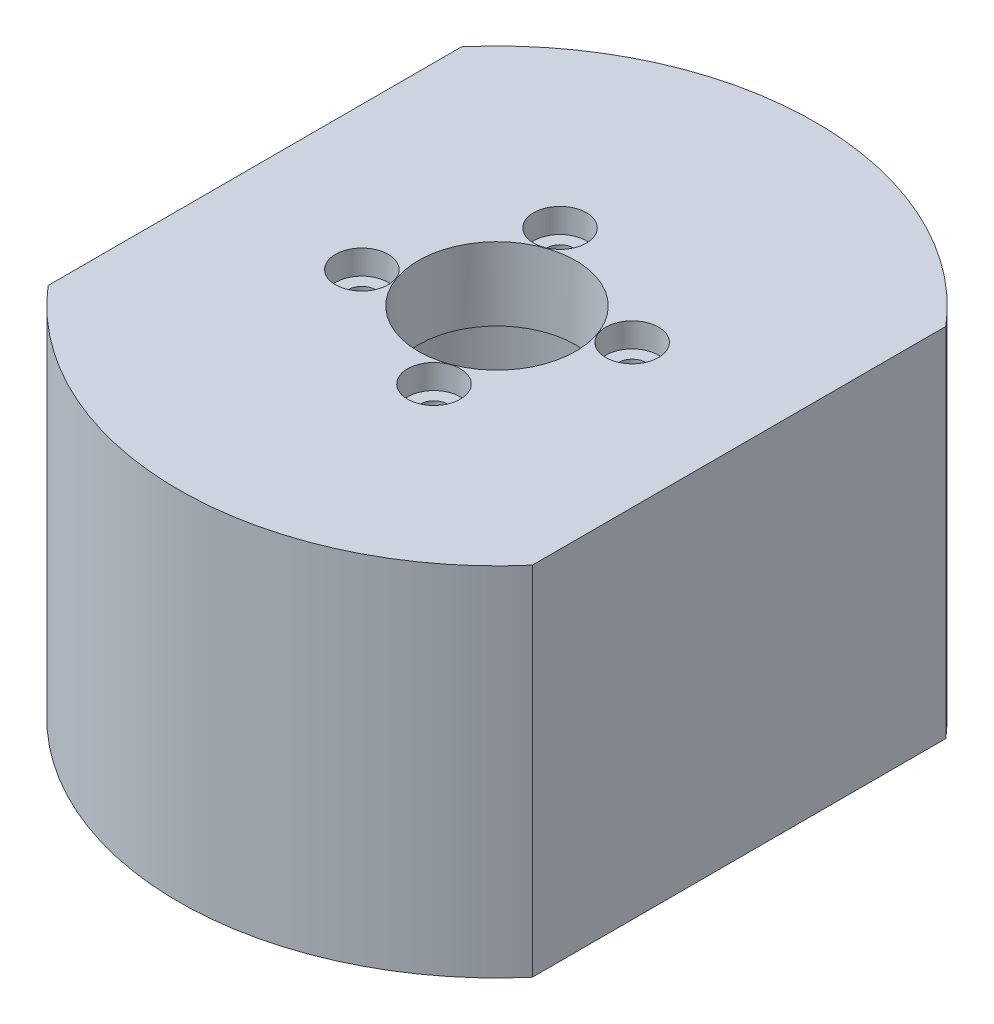
ISO-10303-21;
HEADER;
FILE_DESCRIPTION(('STEP AP214'),'2;1');
FILE_NAME('part.step','',(''),(''),'','','');
FILE_SCHEMA(('AUTOMOTIVE_DESIGN { 1 0 10303 214 1 1 1 1 }'));
ENDSEC;
DATA;
#1=APPLICATION_CONTEXT('core data for automotive mechanical design processes');
#2=APPLICATION_PROTOCOL_DEFINITION('international standard','automotive_design',2000,#1);
#3=PRODUCT_CONTEXT('',#1,'mechanical');
#4=PRODUCT('Part','Part','',(#3));
#5=PRODUCT_RELATED_PRODUCT_CATEGORY('part','',(#4));
#6=PRODUCT_DEFINITION_FORMATION('','',#4);
#7=PRODUCT_DEFINITION_CONTEXT('part definition',#1,'design');
#8=PRODUCT_DEFINITION('design','',#6,#7);
#9=PRODUCT_DEFINITION_SHAPE('','',#8);
#10=(LENGTH_UNIT() NAMED_UNIT(*) SI_UNIT(.MILLI.,.METRE.));
#11=(NAMED_UNIT(*) PLANE_ANGLE_UNIT() SI_UNIT($,.RADIAN.));
#12=(NAMED_UNIT(*) SI_UNIT($,.STERADIAN.) SOLID_ANGLE_UNIT());
#13=UNCERTAINTY_MEASURE_WITH_UNIT(LENGTH_MEASURE(1.E-05),#10,'distance_accuracy_value','');
#14=(GEOMETRIC_REPRESENTATION_CONTEXT(3) GLOBAL_UNCERTAINTY_ASSIGNED_CONTEXT((#13)) GLOBAL_UNIT_ASSIGNED_CONTEXT((#10,
#11,#12)) REPRESENTATION_CONTEXT('',''));
#15=CARTESIAN_POINT('',(0.,0.,0.));
#16=DIRECTION('',(0.,0.,1.));
#17=DIRECTION('',(1.,0.,0.));
#18=AXIS2_PLACEMENT_3D('',#15,#16,#17);
#19=CARTESIAN_POINT('',(-4.4462618632337,44.,-12.2160040702168));
#20=DIRECTION('',(0.,1.,0.));
#21=DIRECTION('',(0.,0.,1.));
#22=AXIS2_PLACEMENT_3D('',#19,#20,#21);
#23=CYLINDRICAL_SURFACE('',#22,1.69999999999999);
#24=CARTESIAN_POINT('',(-4.4462618632337,41.,-12.2160040702168));
#25=DIRECTION('',(0.,1.,0.));
#26=DIRECTION('',(0.,0.,1.));
#27=AXIS2_PLACEMENT_3D('',#24,#25,#26);
#28=CIRCLE('',#27,1.7);
#29=CARTESIAN_POINT('',(-4.4462618632337,41.,-10.5160040702168));
#30=VERTEX_POINT('',#29);
#31=EDGE_CURVE('E87',#30,#30,#28,.T.);
#32=ORIENTED_EDGE('',*,*,#31,.T.);
#33=EDGE_LOOP('',(#32));
#34=FACE_BOUND('',#33,.T.);
#35=CARTESIAN_POINT('',(-4.4462618632337,35.,-12.2160040702168));
#36=DIRECTION('',(0.,-1.,0.));
#37=DIRECTION('',(0.,0.,-1.));
#38=AXIS2_PLACEMENT_3D('',#35,#36,#37);
#39=CIRCLE('',#38,1.69999999999999);
#40=CARTESIAN_POINT('',(-4.4462618632337,35.,-13.9160040702168));
#41=VERTEX_POINT('',#40);
#42=EDGE_CURVE('E122',#41,#41,#39,.F.);
#43=ORIENTED_EDGE('',*,*,#42,.F.);
#44=EDGE_LOOP('',(#43));
#45=FACE_BOUND('',#44,.T.);
#46=ADVANCED_FACE('F39',(#34,#45),#23,.F.);
#47=CARTESIAN_POINT('',(12.2160040702168,44.,-4.44626186323366));
#48=DIRECTION('',(0.,1.,0.));
#49=DIRECTION('',(0.,0.,1.));
#50=AXIS2_PLACEMENT_3D('',#47,#48,#49);
#51=CYLINDRICAL_SURFACE('',#50,1.69999999999999);
#52=CARTESIAN_POINT('',(12.2160040702168,41.,-4.44626186323366));
#53=DIRECTION('',(0.,1.,0.));
#54=DIRECTION('',(0.,0.,1.));
#55=AXIS2_PLACEMENT_3D('',#52,#53,#54);
#56=CIRCLE('',#55,1.7);
#57=CARTESIAN_POINT('',(12.2160040702168,41.,-2.74626186323366));
#58=VERTEX_POINT('',#57);
#59=EDGE_CURVE('E149',#58,#58,#56,.T.);
#60=ORIENTED_EDGE('',*,*,#59,.T.);
#61=EDGE_LOOP('',(#60));
#62=FACE_BOUND('',#61,.T.);
#63=CARTESIAN_POINT('',(12.2160040702168,35.,-4.44626186323366));
#64=DIRECTION('',(0.,-1.,0.));
#65=DIRECTION('',(0.,0.,-1.));
#66=AXIS2_PLACEMENT_3D('',#63,#64,#65);
#67=CIRCLE('',#66,1.69999999999999);
#68=CARTESIAN_POINT('',(12.2160040702168,35.,-6.14626186323365));
#69=VERTEX_POINT('',#68);
#70=EDGE_CURVE('E119',#69,#69,#67,.F.);
#71=ORIENTED_EDGE('',*,*,#70,.F.);
#72=EDGE_LOOP('',(#71));
#73=FACE_BOUND('',#72,.T.);
#74=ADVANCED_FACE('F178',(#62,#73),#51,.F.);
#75=CARTESIAN_POINT('',(4.4462618632337,44.,12.2160040702168));
#76=DIRECTION('',(0.,1.,0.));
#77=DIRECTION('',(0.,0.,1.));
#78=AXIS2_PLACEMENT_3D('',#75,#76,#77);
#79=CYLINDRICAL_SURFACE('',#78,1.69999999999999);
#80=CARTESIAN_POINT('',(4.4462618632337,41.,12.2160040702168));
#81=DIRECTION('',(0.,1.,0.));
#82=DIRECTION('',(0.,0.,1.));
#83=AXIS2_PLACEMENT_3D('',#80,#81,#82);
#84=CIRCLE('',#83,1.7);
#85=CARTESIAN_POINT('',(4.4462618632337,41.,13.9160040702168));
#86=VERTEX_POINT('',#85);
#87=EDGE_CURVE('E140',#86,#86,#84,.T.);
#88=ORIENTED_EDGE('',*,*,#87,.T.);
#89=EDGE_LOOP('',(#88));
#90=FACE_BOUND('',#89,.T.);
#91=CARTESIAN_POINT('',(4.4462618632337,35.,12.2160040702168));
#92=DIRECTION('',(0.,-1.,0.));
#93=DIRECTION('',(0.,0.,-1.));
#94=AXIS2_PLACEMENT_3D('',#91,#92,#93);
#95=CIRCLE('',#94,1.69999999999999);
#96=CARTESIAN_POINT('',(4.4462618632337,35.,10.5160040702168));
#97=VERTEX_POINT('',#96);
#98=EDGE_CURVE('E116',#97,#97,#95,.F.);
#99=ORIENTED_EDGE('',*,*,#98,.F.);
#100=EDGE_LOOP('',(#99));
#101=FACE_BOUND('',#100,.T.);
#102=ADVANCED_FACE('F169',(#90,#101),#79,.F.);
#103=CARTESIAN_POINT('',(-12.2160040702169,44.,4.44626186323358));
#104=DIRECTION('',(0.,1.,0.));
#105=DIRECTION('',(0.,0.,1.));
#106=AXIS2_PLACEMENT_3D('',#103,#104,#105);
#107=CYLINDRICAL_SURFACE('',#106,1.69999999999999);
#108=CARTESIAN_POINT('',(-12.2160040702169,41.,4.44626186323358));
#109=DIRECTION('',(0.,1.,0.));
#110=DIRECTION('',(0.,0.,1.));
#111=AXIS2_PLACEMENT_3D('',#108,#109,#110);
#112=CIRCLE('',#111,1.7);
#113=CARTESIAN_POINT('',(-12.2160040702169,41.,6.14626186323357));
#114=VERTEX_POINT('',#113);
#115=EDGE_CURVE('E131',#114,#114,#112,.T.);
#116=ORIENTED_EDGE('',*,*,#115,.T.);
#117=EDGE_LOOP('',(#116));
#118=FACE_BOUND('',#117,.T.);
#119=CARTESIAN_POINT('',(-12.2160040702169,35.,4.44626186323358));
#120=DIRECTION('',(0.,-1.,0.));
#121=DIRECTION('',(0.,0.,-1.));
#122=AXIS2_PLACEMENT_3D('',#119,#120,#121);
#123=CIRCLE('',#122,1.69999999999999);
#124=CARTESIAN_POINT('',(-12.2160040702169,35.,2.74626186323358));
#125=VERTEX_POINT('',#124);
#126=EDGE_CURVE('E112',#125,#125,#123,.F.);
#127=ORIENTED_EDGE('',*,*,#126,.F.);
#128=EDGE_LOOP('',(#127));
#129=FACE_BOUND('',#128,.T.);
#130=ADVANCED_FACE('F167',(#118,#129),#107,.F.);
#131=CARTESIAN_POINT('',(-29.85,44.,-23.9173577135937));
#132=DIRECTION('',(1.,0.,0.));
#133=DIRECTION('',(0.,0.,-1.));
#134=AXIS2_PLACEMENT_3D('',#131,#132,#133);
#135=PLANE('',#134);
#136=DIRECTION('',(0.,0.,1.));
#137=VECTOR('',#136,1.);
#138=CARTESIAN_POINT('',(-29.85,0.,-23.9173577135937));
#139=LINE('',#138,#137);
#140=CARTESIAN_POINT('',(-29.85,0.,-25.4860746290989));
#141=VERTEX_POINT('',#140);
#142=CARTESIAN_POINT('',(-29.85,0.,25.4860746290989));
#143=VERTEX_POINT('',#142);
#144=EDGE_CURVE('E76',#141,#143,#139,.T.);
#145=ORIENTED_EDGE('',*,*,#144,.T.);
#146=DIRECTION('',(0.,-1.,0.));
#147=VECTOR('',#146,1.);
#148=CARTESIAN_POINT('',(-29.85,105.637487939426,25.4860746290989));
#149=LINE('',#148,#147);
#150=CARTESIAN_POINT('',(-29.85,44.,25.4860746290989));
#151=VERTEX_POINT('',#150);
#152=EDGE_CURVE('E79',#151,#143,#149,.T.);
#153=ORIENTED_EDGE('',*,*,#152,.F.);
#154=DIRECTION('',(0.,0.,1.));
#155=VECTOR('',#154,1.);
#156=CARTESIAN_POINT('',(-29.85,44.,-23.9173577135937));
#157=LINE('',#156,#155);
#158=CARTESIAN_POINT('',(-29.85,44.,-25.4860746290989));
#159=VERTEX_POINT('',#158);
#160=EDGE_CURVE('E49',#159,#151,#157,.T.);
#161=ORIENTED_EDGE('',*,*,#160,.F.);
#162=DIRECTION('',(0.,-1.,0.));
#163=VECTOR('',#162,1.);
#164=CARTESIAN_POINT('',(-29.85,105.637487939426,-25.4860746290989));
#165=LINE('',#164,#163);
#166=EDGE_CURVE('E82',#159,#141,#165,.T.);
#167=ORIENTED_EDGE('',*,*,#166,.T.);
#168=EDGE_LOOP('',(#145,#153,#161,#167));
#169=FACE_BOUND('',#168,.T.);
#170=ADVANCED_FACE('F41',(#169),#135,.F.);
#171=CARTESIAN_POINT('',(29.85,44.,-23.9173577135937));
#172=DIRECTION('',(-1.,0.,0.));
#173=DIRECTION('',(0.,0.,1.));
#174=AXIS2_PLACEMENT_3D('',#171,#172,#173);
#175=PLANE('',#174);
#176=DIRECTION('',(0.,0.,-1.));
#177=VECTOR('',#176,1.);
#178=CARTESIAN_POINT('',(29.85,0.,-23.9173577135937));
#179=LINE('',#178,#177);
#180=CARTESIAN_POINT('',(29.85,0.,25.4860746290989));
#181=VERTEX_POINT('',#180);
#182=CARTESIAN_POINT('',(29.85,0.,-25.4860746290989));
#183=VERTEX_POINT('',#182);
#184=EDGE_CURVE('E58',#181,#183,#179,.T.);
#185=ORIENTED_EDGE('',*,*,#184,.T.);
#186=DIRECTION('',(0.,-1.,0.));
#187=VECTOR('',#186,1.);
#188=CARTESIAN_POINT('',(29.85,105.637487939426,-25.4860746290989));
#189=LINE('',#188,#187);
#190=CARTESIAN_POINT('',(29.85,44.,-25.4860746290989));
#191=VERTEX_POINT('',#190);
#192=EDGE_CURVE('E108',#191,#183,#189,.T.);
#193=ORIENTED_EDGE('',*,*,#192,.F.);
#194=DIRECTION('',(0.,0.,-1.));
#195=VECTOR('',#194,1.);
#196=CARTESIAN_POINT('',(29.85,44.,-23.9173577135937));
#197=LINE('',#196,#195);
#198=CARTESIAN_POINT('',(29.85,44.,25.4860746290989));
#199=VERTEX_POINT('',#198);
#200=EDGE_CURVE('E11',#199,#191,#197,.T.);
#201=ORIENTED_EDGE('',*,*,#200,.F.);
#202=DIRECTION('',(0.,-1.,0.));
#203=VECTOR('',#202,1.);
#204=CARTESIAN_POINT('',(29.85,105.637487939426,25.4860746290989));
#205=LINE('',#204,#203);
#206=EDGE_CURVE('E99',#199,#181,#205,.T.);
#207=ORIENTED_EDGE('',*,*,#206,.T.);
#208=EDGE_LOOP('',(#185,#193,#201,#207));
#209=FACE_BOUND('',#208,.T.);
#210=ADVANCED_FACE('F177',(#209),#175,.F.);
#211=CARTESIAN_POINT('',(0.,44.,0.));
#212=DIRECTION('',(0.,1.,0.));
#213=DIRECTION('',(0.,0.,1.));
#214=AXIS2_PLACEMENT_3D('',#211,#212,#213);
#215=PLANE('',#214);
#216=CARTESIAN_POINT('',(0.,44.,0.));
#217=DIRECTION('',(0.,1.,0.));
#218=DIRECTION('',(0.,0.,1.));
#219=AXIS2_PLACEMENT_3D('',#216,#217,#218);
#220=CIRCLE('',#219,9.7);
#221=CARTESIAN_POINT('',(0.,44.,9.7));
#222=VERTEX_POINT('',#221);
#223=EDGE_CURVE('E105',#222,#222,#220,.T.);
#224=ORIENTED_EDGE('',*,*,#223,.F.);
#225=EDGE_LOOP('',(#224));
#226=FACE_BOUND('',#225,.T.);
#227=CARTESIAN_POINT('',(-12.2160040702169,44.,4.44626186323358));
#228=DIRECTION('',(0.,1.,0.));
#229=DIRECTION('',(0.,0.,1.));
#230=AXIS2_PLACEMENT_3D('',#227,#228,#229);
#231=CIRCLE('',#230,3.25);
#232=CARTESIAN_POINT('',(-12.2160040702169,44.,7.69626186323357));
#233=VERTEX_POINT('',#232);
#234=EDGE_CURVE('E125',#233,#233,#231,.T.);
#235=ORIENTED_EDGE('',*,*,#234,.F.);
#236=EDGE_LOOP('',(#235));
#237=FACE_BOUND('',#236,.T.);
#238=CARTESIAN_POINT('',(4.4462618632337,44.,12.2160040702168));
#239=DIRECTION('',(0.,1.,0.));
#240=DIRECTION('',(0.,0.,1.));
#241=AXIS2_PLACEMENT_3D('',#238,#239,#240);
#242=CIRCLE('',#241,3.25);
#243=CARTESIAN_POINT('',(4.4462618632337,44.,15.4660040702168));
#244=VERTEX_POINT('',#243);
#245=EDGE_CURVE('E134',#244,#244,#242,.T.);
#246=ORIENTED_EDGE('',*,*,#245,.F.);
#247=EDGE_LOOP('',(#246));
#248=FACE_BOUND('',#247,.T.);
#249=CARTESIAN_POINT('',(12.2160040702168,44.,-4.44626186323366));
#250=DIRECTION('',(0.,1.,0.));
#251=DIRECTION('',(0.,0.,1.));
#252=AXIS2_PLACEMENT_3D('',#249,#250,#251);
#253=CIRCLE('',#252,3.25);
#254=CARTESIAN_POINT('',(12.2160040702168,44.,-1.19626186323366));
#255=VERTEX_POINT('',#254);
#256=EDGE_CURVE('E143',#255,#255,#253,.T.);
#257=ORIENTED_EDGE('',*,*,#256,.F.);
#258=EDGE_LOOP('',(#257));
#259=FACE_BOUND('',#258,.T.);
#260=CARTESIAN_POINT('',(-4.4462618632337,44.,-12.2160040702168));
#261=DIRECTION('',(0.,1.,0.));
#262=DIRECTION('',(0.,0.,1.));
#263=AXIS2_PLACEMENT_3D('',#260,#261,#262);
#264=CIRCLE('',#263,3.25);
#265=CARTESIAN_POINT('',(-4.4462618632337,44.,-8.96600407021681));
#266=VERTEX_POINT('',#265);
#267=EDGE_CURVE('E152',#266,#266,#264,.T.);
#268=ORIENTED_EDGE('',*,*,#267,.F.);
#269=EDGE_LOOP('',(#268));
#270=FACE_BOUND('',#269,.T.);
#271=ORIENTED_EDGE('',*,*,#200,.T.);
#272=CARTESIAN_POINT('',(0.,44.,-1.14491749414469E-13));
#273=DIRECTION('',(0.,1.,0.));
#274=DIRECTION('',(0.,0.,1.));
#275=AXIS2_PLACEMENT_3D('',#272,#273,#274);
#276=CIRCLE('',#275,39.2499999999999);
#277=EDGE_CURVE('E399',#159,#191,#276,.F.);
#278=ORIENTED_EDGE('',*,*,#277,.F.);
#279=ORIENTED_EDGE('',*,*,#160,.T.);
#280=CARTESIAN_POINT('',(0.,44.,0.));
#281=DIRECTION('',(0.,1.,0.));
#282=DIRECTION('',(0.,0.,1.));
#283=AXIS2_PLACEMENT_3D('',#280,#281,#282);
#284=CIRCLE('',#283,39.25);
#285=EDGE_CURVE('E95',#199,#151,#284,.F.);
#286=ORIENTED_EDGE('',*,*,#285,.F.);
#287=EDGE_LOOP('',(#271,#278,#279,#286));
#288=FACE_BOUND('',#287,.T.);
#289=ADVANCED_FACE('F197',(#226,#237,#248,#259,#270,#288),#215,.T.);
#290=CARTESIAN_POINT('',(0.,0.,0.));
#291=DIRECTION('',(0.,1.,0.));
#292=DIRECTION('',(0.,0.,1.));
#293=AXIS2_PLACEMENT_3D('',#290,#291,#292);
#294=PLANE('',#293);
#295=CARTESIAN_POINT('',(0.,0.,0.));
#296=DIRECTION('',(0.,-1.,0.));
#297=DIRECTION('',(0.,0.,-1.));
#298=AXIS2_PLACEMENT_3D('',#295,#296,#297);
#299=CIRCLE('',#298,16.2);
#300=CARTESIAN_POINT('',(0.,0.,-16.2));
#301=VERTEX_POINT('',#300);
#302=EDGE_CURVE('E113',#301,#301,#299,.T.);
#303=ORIENTED_EDGE('',*,*,#302,.F.);
#304=EDGE_LOOP('',(#303));
#305=FACE_BOUND('',#304,.T.);
#306=ORIENTED_EDGE('',*,*,#144,.F.);
#307=CARTESIAN_POINT('',(0.,0.,-1.14491749414469E-13));
#308=DIRECTION('',(0.,-1.,0.));
#309=DIRECTION('',(0.,0.,-1.));
#310=AXIS2_PLACEMENT_3D('',#307,#308,#309);
#311=CIRCLE('',#310,39.2499999999999);
#312=EDGE_CURVE('E98',#141,#183,#311,.T.);
#313=ORIENTED_EDGE('',*,*,#312,.T.);
#314=ORIENTED_EDGE('',*,*,#184,.F.);
#315=CARTESIAN_POINT('',(0.,0.,0.));
#316=DIRECTION('',(0.,-1.,0.));
#317=DIRECTION('',(0.,0.,1.));
#318=AXIS2_PLACEMENT_3D('',#315,#316,#317);
#319=CIRCLE('',#318,39.25);
#320=EDGE_CURVE('E93',#181,#143,#319,.T.);
#321=ORIENTED_EDGE('',*,*,#320,.T.);
#322=EDGE_LOOP('',(#306,#313,#314,#321));
#323=FACE_BOUND('',#322,.T.);
#324=ADVANCED_FACE('F97',(#305,#323),#294,.F.);
#325=CARTESIAN_POINT('',(-2.7462618632337,41.,-12.2160040702168));
#326=DIRECTION('',(0.,-1.,0.));
#327=DIRECTION('',(0.,0.,-1.));
#328=AXIS2_PLACEMENT_3D('',#325,#326,#327);
#329=PLANE('',#328);
#330=ORIENTED_EDGE('',*,*,#31,.F.);
#331=EDGE_LOOP('',(#330));
#332=FACE_BOUND('',#331,.T.);
#333=CARTESIAN_POINT('',(-4.4462618632337,41.,-12.2160040702168));
#334=DIRECTION('',(0.,1.,0.));
#335=DIRECTION('',(0.,0.,1.));
#336=AXIS2_PLACEMENT_3D('',#333,#334,#335);
#337=CIRCLE('',#336,3.25);
#338=CARTESIAN_POINT('',(-4.4462618632337,41.,-8.96600407021681));
#339=VERTEX_POINT('',#338);
#340=EDGE_CURVE('E155',#339,#339,#337,.T.);
#341=ORIENTED_EDGE('',*,*,#340,.T.);
#342=EDGE_LOOP('',(#341));
#343=FACE_BOUND('',#342,.T.);
#344=ADVANCED_FACE('F195',(#332,#343),#329,.F.);
#345=CARTESIAN_POINT('',(-4.4462618632337,44.,-12.2160040702168));
#346=DIRECTION('',(0.,1.,0.));
#347=DIRECTION('',(0.,0.,1.));
#348=AXIS2_PLACEMENT_3D('',#345,#346,#347);
#349=CYLINDRICAL_SURFACE('',#348,3.25);
#350=ORIENTED_EDGE('',*,*,#340,.F.);
#351=EDGE_LOOP('',(#350));
#352=FACE_BOUND('',#351,.T.);
#353=ORIENTED_EDGE('',*,*,#267,.T.);
#354=EDGE_LOOP('',(#353));
#355=FACE_BOUND('',#354,.T.);
#356=ADVANCED_FACE('F333',(#352,#355),#349,.F.);
#357=CARTESIAN_POINT('',(13.9160040702168,41.,-4.44626186323366));
#358=DIRECTION('',(0.,-1.,0.));
#359=DIRECTION('',(0.,0.,-1.));
#360=AXIS2_PLACEMENT_3D('',#357,#358,#359);
#361=PLANE('',#360);
#362=ORIENTED_EDGE('',*,*,#59,.F.);
#363=EDGE_LOOP('',(#362));
#364=FACE_BOUND('',#363,.T.);
#365=CARTESIAN_POINT('',(12.2160040702168,41.,-4.44626186323366));
#366=DIRECTION('',(0.,1.,0.));
#367=DIRECTION('',(0.,0.,1.));
#368=AXIS2_PLACEMENT_3D('',#365,#366,#367);
#369=CIRCLE('',#368,3.25);
#370=CARTESIAN_POINT('',(12.2160040702168,41.,-1.19626186323366));
#371=VERTEX_POINT('',#370);
#372=EDGE_CURVE('E146',#371,#371,#369,.T.);
#373=ORIENTED_EDGE('',*,*,#372,.T.);
#374=EDGE_LOOP('',(#373));
#375=FACE_BOUND('',#374,.T.);
#376=ADVANCED_FACE('F324',(#364,#375),#361,.F.);
#377=CARTESIAN_POINT('',(12.2160040702168,44.,-4.44626186323366));
#378=DIRECTION('',(0.,1.,0.));
#379=DIRECTION('',(0.,0.,1.));
#380=AXIS2_PLACEMENT_3D('',#377,#378,#379);
#381=CYLINDRICAL_SURFACE('',#380,3.25);
#382=ORIENTED_EDGE('',*,*,#372,.F.);
#383=EDGE_LOOP('',(#382));
#384=FACE_BOUND('',#383,.T.);
#385=ORIENTED_EDGE('',*,*,#256,.T.);
#386=EDGE_LOOP('',(#385));
#387=FACE_BOUND('',#386,.T.);
#388=ADVANCED_FACE('F315',(#384,#387),#381,.F.);
#389=CARTESIAN_POINT('',(6.1462618632337,41.,12.2160040702168));
#390=DIRECTION('',(0.,-1.,0.));
#391=DIRECTION('',(0.,0.,-1.));
#392=AXIS2_PLACEMENT_3D('',#389,#390,#391);
#393=PLANE('',#392);
#394=ORIENTED_EDGE('',*,*,#87,.F.);
#395=EDGE_LOOP('',(#394));
#396=FACE_BOUND('',#395,.T.);
#397=CARTESIAN_POINT('',(4.4462618632337,41.,12.2160040702168));
#398=DIRECTION('',(0.,1.,0.));
#399=DIRECTION('',(0.,0.,1.));
#400=AXIS2_PLACEMENT_3D('',#397,#398,#399);
#401=CIRCLE('',#400,3.25);
#402=CARTESIAN_POINT('',(4.4462618632337,41.,15.4660040702168));
#403=VERTEX_POINT('',#402);
#404=EDGE_CURVE('E137',#403,#403,#401,.T.);
#405=ORIENTED_EDGE('',*,*,#404,.T.);
#406=EDGE_LOOP('',(#405));
#407=FACE_BOUND('',#406,.T.);
#408=ADVANCED_FACE('F307',(#396,#407),#393,.F.);
#409=CARTESIAN_POINT('',(4.4462618632337,44.,12.2160040702168));
#410=DIRECTION('',(0.,1.,0.));
#411=DIRECTION('',(0.,0.,1.));
#412=AXIS2_PLACEMENT_3D('',#409,#410,#411);
#413=CYLINDRICAL_SURFACE('',#412,3.25);
#414=ORIENTED_EDGE('',*,*,#404,.F.);
#415=EDGE_LOOP('',(#414));
#416=FACE_BOUND('',#415,.T.);
#417=ORIENTED_EDGE('',*,*,#245,.T.);
#418=EDGE_LOOP('',(#417));
#419=FACE_BOUND('',#418,.T.);
#420=ADVANCED_FACE('F299',(#416,#419),#413,.F.);
#421=CARTESIAN_POINT('',(-10.5160040702169,41.,4.44626186323358));
#422=DIRECTION('',(0.,-1.,0.));
#423=DIRECTION('',(0.,0.,-1.));
#424=AXIS2_PLACEMENT_3D('',#421,#422,#423);
#425=PLANE('',#424);
#426=ORIENTED_EDGE('',*,*,#115,.F.);
#427=EDGE_LOOP('',(#426));
#428=FACE_BOUND('',#427,.T.);
#429=CARTESIAN_POINT('',(-12.2160040702169,41.,4.44626186323358));
#430=DIRECTION('',(0.,1.,0.));
#431=DIRECTION('',(0.,0.,1.));
#432=AXIS2_PLACEMENT_3D('',#429,#430,#431);
#433=CIRCLE('',#432,3.25);
#434=CARTESIAN_POINT('',(-12.2160040702169,41.,7.69626186323357));
#435=VERTEX_POINT('',#434);
#436=EDGE_CURVE('E128',#435,#435,#433,.T.);
#437=ORIENTED_EDGE('',*,*,#436,.T.);
#438=EDGE_LOOP('',(#437));
#439=FACE_BOUND('',#438,.T.);
#440=ADVANCED_FACE('F290',(#428,#439),#425,.F.);
#441=CARTESIAN_POINT('',(-12.2160040702169,44.,4.44626186323358));
#442=DIRECTION('',(0.,1.,0.));
#443=DIRECTION('',(0.,0.,1.));
#444=AXIS2_PLACEMENT_3D('',#441,#442,#443);
#445=CYLINDRICAL_SURFACE('',#444,3.25);
#446=ORIENTED_EDGE('',*,*,#436,.F.);
#447=EDGE_LOOP('',(#446));
#448=FACE_BOUND('',#447,.T.);
#449=ORIENTED_EDGE('',*,*,#234,.T.);
#450=EDGE_LOOP('',(#449));
#451=FACE_BOUND('',#450,.T.);
#452=ADVANCED_FACE('F261',(#448,#451),#445,.F.);
#453=CARTESIAN_POINT('',(0.,35.,0.));
#454=DIRECTION('',(0.,-1.,0.));
#455=DIRECTION('',(0.,0.,-1.));
#456=AXIS2_PLACEMENT_3D('',#453,#454,#455);
#457=PLANE('',#456);
#458=CARTESIAN_POINT('',(0.,35.,0.));
#459=DIRECTION('',(0.,-1.,0.));
#460=DIRECTION('',(0.,0.,-1.));
#461=AXIS2_PLACEMENT_3D('',#458,#459,#460);
#462=CIRCLE('',#461,9.7);
#463=CARTESIAN_POINT('',(0.,35.,-9.7));
#464=VERTEX_POINT('',#463);
#465=EDGE_CURVE('E43',#464,#464,#462,.T.);
#466=ORIENTED_EDGE('',*,*,#465,.F.);
#467=EDGE_LOOP('',(#466));
#468=FACE_BOUND('',#467,.T.);
#469=CARTESIAN_POINT('',(0.,35.,0.));
#470=DIRECTION('',(0.,-1.,0.));
#471=DIRECTION('',(0.,0.,-1.));
#472=AXIS2_PLACEMENT_3D('',#469,#470,#471);
#473=CIRCLE('',#472,16.2);
#474=CARTESIAN_POINT('',(0.,35.,-16.2));
#475=VERTEX_POINT('',#474);
#476=EDGE_CURVE('E109',#475,#475,#473,.T.);
#477=ORIENTED_EDGE('',*,*,#476,.T.);
#478=EDGE_LOOP('',(#477));
#479=FACE_BOUND('',#478,.T.);
#480=ORIENTED_EDGE('',*,*,#126,.T.);
#481=EDGE_LOOP('',(#480));
#482=FACE_BOUND('',#481,.T.);
#483=ORIENTED_EDGE('',*,*,#98,.T.);
#484=EDGE_LOOP('',(#483));
#485=FACE_BOUND('',#484,.T.);
#486=ORIENTED_EDGE('',*,*,#70,.T.);
#487=EDGE_LOOP('',(#486));
#488=FACE_BOUND('',#487,.T.);
#489=ORIENTED_EDGE('',*,*,#42,.T.);
#490=EDGE_LOOP('',(#489));
#491=FACE_BOUND('',#490,.T.);
#492=ADVANCED_FACE('F164',(#468,#479,#482,#485,#488,#491),#457,.T.);
#493=CARTESIAN_POINT('',(0.,35.,0.));
#494=DIRECTION('',(0.,-1.,0.));
#495=DIRECTION('',(0.,0.,-1.));
#496=AXIS2_PLACEMENT_3D('',#493,#494,#495);
#497=CYLINDRICAL_SURFACE('',#496,16.2);
#498=ORIENTED_EDGE('',*,*,#476,.F.);
#499=EDGE_LOOP('',(#498));
#500=FACE_BOUND('',#499,.T.);
#501=ORIENTED_EDGE('',*,*,#302,.T.);
#502=EDGE_LOOP('',(#501));
#503=FACE_BOUND('',#502,.T.);
#504=ADVANCED_FACE('F245',(#500,#503),#497,.F.);
#505=CARTESIAN_POINT('',(0.,0.,0.));
#506=DIRECTION('',(0.,1.,0.));
#507=DIRECTION('',(0.,0.,1.));
#508=AXIS2_PLACEMENT_3D('',#505,#506,#507);
#509=CYLINDRICAL_SURFACE('',#508,9.7);
#510=ORIENTED_EDGE('',*,*,#465,.T.);
#511=EDGE_LOOP('',(#510));
#512=FACE_BOUND('',#511,.T.);
#513=ORIENTED_EDGE('',*,*,#223,.T.);
#514=EDGE_LOOP('',(#513));
#515=FACE_BOUND('',#514,.T.);
#516=ADVANCED_FACE('F227',(#512,#515),#509,.F.);
#517=CARTESIAN_POINT('',(0.,105.637487939426,0.));
#518=DIRECTION('',(0.,-1.,0.));
#519=DIRECTION('',(0.,0.,-1.));
#520=AXIS2_PLACEMENT_3D('',#517,#518,#519);
#521=CYLINDRICAL_SURFACE('',#520,39.25);
#522=ORIENTED_EDGE('',*,*,#206,.F.);
#523=ORIENTED_EDGE('',*,*,#285,.T.);
#524=ORIENTED_EDGE('',*,*,#152,.T.);
#525=ORIENTED_EDGE('',*,*,#320,.F.);
#526=EDGE_LOOP('',(#522,#523,#524,#525));
#527=FACE_BOUND('',#526,.T.);
#528=ADVANCED_FACE('F92',(#527),#521,.T.);
#529=CARTESIAN_POINT('',(0.,105.637487939426,-1.14491749414469E-13));
#530=DIRECTION('',(0.,-1.,0.));
#531=DIRECTION('',(0.,0.,-1.));
#532=AXIS2_PLACEMENT_3D('',#529,#530,#531);
#533=CYLINDRICAL_SURFACE('',#532,39.2499999999999);
#534=ORIENTED_EDGE('',*,*,#166,.F.);
#535=ORIENTED_EDGE('',*,*,#277,.T.);
#536=ORIENTED_EDGE('',*,*,#192,.T.);
#537=ORIENTED_EDGE('',*,*,#312,.F.);
#538=EDGE_LOOP('',(#534,#535,#536,#537));
#539=FACE_BOUND('',#538,.T.);
#540=ADVANCED_FACE('F226',(#539),#533,.T.);
#541=CLOSED_SHELL('',(#46,#74,#102,#130,#170,#210,#289,#324,#344,#356,#376,#388,#408,#420,#440,
#452,#492,#504,#516,#528,#540));
#542=MANIFOLD_SOLID_BREP('B2',#541);
#543=ADVANCED_BREP_SHAPE_REPRESENTATION('',(#18,#542),#14);
#544=SHAPE_DEFINITION_REPRESENTATION(#9,#543);
ENDSEC;
END-ISO-10303-21;
